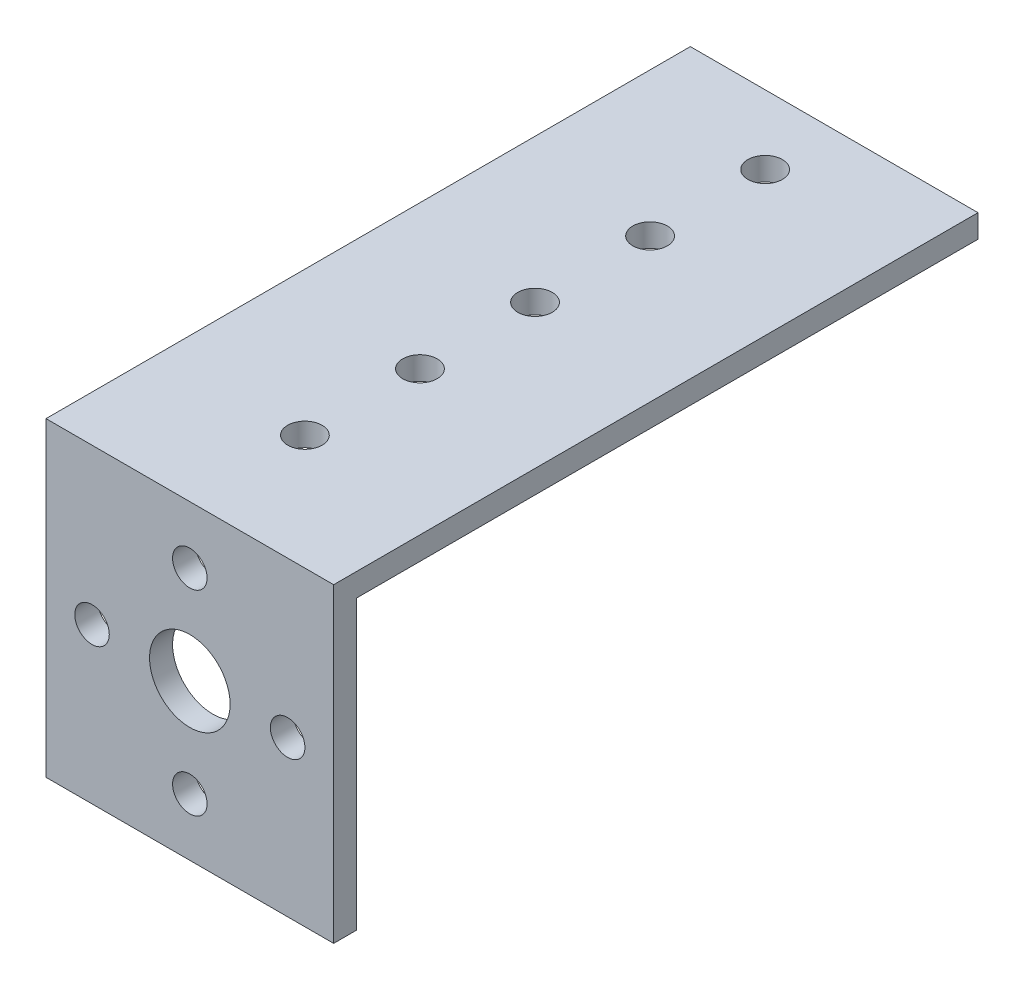
ISO-10303-21;
HEADER;
FILE_DESCRIPTION(('STEP AP214'),'2;1');
FILE_NAME('part.step','',(''),(''),'','','');
FILE_SCHEMA(('AUTOMOTIVE_DESIGN { 1 0 10303 214 1 1 1 1 }'));
ENDSEC;
DATA;
#1=APPLICATION_CONTEXT('core data for automotive mechanical design processes');
#2=APPLICATION_PROTOCOL_DEFINITION('international standard','automotive_design',2000,#1);
#3=PRODUCT_CONTEXT('',#1,'mechanical');
#4=PRODUCT('Part','Part','',(#3));
#5=PRODUCT_RELATED_PRODUCT_CATEGORY('part','',(#4));
#6=PRODUCT_DEFINITION_FORMATION('','',#4);
#7=PRODUCT_DEFINITION_CONTEXT('part definition',#1,'design');
#8=PRODUCT_DEFINITION('design','',#6,#7);
#9=PRODUCT_DEFINITION_SHAPE('','',#8);
#10=(LENGTH_UNIT() NAMED_UNIT(*) SI_UNIT(.MILLI.,.METRE.));
#11=(NAMED_UNIT(*) PLANE_ANGLE_UNIT() SI_UNIT($,.RADIAN.));
#12=(NAMED_UNIT(*) SI_UNIT($,.STERADIAN.) SOLID_ANGLE_UNIT());
#13=UNCERTAINTY_MEASURE_WITH_UNIT(LENGTH_MEASURE(1.E-05),#10,'distance_accuracy_value','');
#14=(GEOMETRIC_REPRESENTATION_CONTEXT(3) GLOBAL_UNCERTAINTY_ASSIGNED_CONTEXT((#13)) GLOBAL_UNIT_ASSIGNED_CONTEXT((#10,
#11,#12)) REPRESENTATION_CONTEXT('',''));
#15=CARTESIAN_POINT('',(0.,0.,0.));
#16=DIRECTION('',(0.,0.,1.));
#17=DIRECTION('',(1.,0.,0.));
#18=AXIS2_PLACEMENT_3D('',#15,#16,#17);
#19=CARTESIAN_POINT('',(25.,0.,-2.));
#20=DIRECTION('',(0.,1.,0.));
#21=DIRECTION('',(0.,0.,1.));
#22=AXIS2_PLACEMENT_3D('',#19,#20,#21);
#23=PLANE('',#22);
#24=DIRECTION('',(0.,0.,-1.));
#25=VECTOR('',#24,1.);
#26=CARTESIAN_POINT('',(0.,0.,-2.));
#27=LINE('',#26,#25);
#28=CARTESIAN_POINT('',(0.,0.,0.));
#29=VERTEX_POINT('',#28);
#30=CARTESIAN_POINT('',(0.,0.,-2.));
#31=VERTEX_POINT('',#30);
#32=EDGE_CURVE('E127',#29,#31,#27,.T.);
#33=ORIENTED_EDGE('',*,*,#32,.T.);
#34=DIRECTION('',(-1.,0.,0.));
#35=VECTOR('',#34,1.);
#36=CARTESIAN_POINT('',(25.,0.,-2.));
#37=LINE('',#36,#35);
#38=CARTESIAN_POINT('',(25.,0.,-2.));
#39=VERTEX_POINT('',#38);
#40=EDGE_CURVE('E11',#39,#31,#37,.T.);
#41=ORIENTED_EDGE('',*,*,#40,.F.);
#42=DIRECTION('',(0.,0.,-1.));
#43=VECTOR('',#42,1.);
#44=CARTESIAN_POINT('',(25.,0.,-2.));
#45=LINE('',#44,#43);
#46=CARTESIAN_POINT('',(25.,0.,0.));
#47=VERTEX_POINT('',#46);
#48=EDGE_CURVE('E144',#47,#39,#45,.T.);
#49=ORIENTED_EDGE('',*,*,#48,.F.);
#50=DIRECTION('',(-1.,0.,0.));
#51=VECTOR('',#50,1.);
#52=CARTESIAN_POINT('',(25.,0.,0.));
#53=LINE('',#52,#51);
#54=EDGE_CURVE('E123',#47,#29,#53,.T.);
#55=ORIENTED_EDGE('',*,*,#54,.T.);
#56=EDGE_LOOP('',(#33,#41,#49,#55));
#57=FACE_BOUND('',#56,.T.);
#58=ADVANCED_FACE('F38',(#57),#23,.F.);
#59=CARTESIAN_POINT('',(25.,25.,-2.));
#60=DIRECTION('',(0.,0.,1.));
#61=DIRECTION('',(0.,-1.,0.));
#62=AXIS2_PLACEMENT_3D('',#59,#60,#61);
#63=PLANE('',#62);
#64=CARTESIAN_POINT('',(12.5,22.,-2.));
#65=DIRECTION('',(0.,0.,1.));
#66=DIRECTION('',(0.,-1.,0.));
#67=AXIS2_PLACEMENT_3D('',#64,#65,#66);
#68=CIRCLE('',#67,1.5);
#69=CARTESIAN_POINT('',(12.5,20.5,-2.));
#70=VERTEX_POINT('',#69);
#71=EDGE_CURVE('E132',#70,#70,#68,.T.);
#72=ORIENTED_EDGE('',*,*,#71,.T.);
#73=EDGE_LOOP('',(#72));
#74=FACE_BOUND('',#73,.T.);
#75=CARTESIAN_POINT('',(12.5,5.00000000000001,-2.));
#76=DIRECTION('',(0.,0.,1.));
#77=DIRECTION('',(0.,-1.,0.));
#78=AXIS2_PLACEMENT_3D('',#75,#76,#77);
#79=CIRCLE('',#78,1.5);
#80=CARTESIAN_POINT('',(12.5,3.50000000000001,-2.));
#81=VERTEX_POINT('',#80);
#82=EDGE_CURVE('E368',#81,#81,#79,.T.);
#83=ORIENTED_EDGE('',*,*,#82,.T.);
#84=EDGE_LOOP('',(#83));
#85=FACE_BOUND('',#84,.T.);
#86=CARTESIAN_POINT('',(21.,13.5,-2.));
#87=DIRECTION('',(0.,0.,1.));
#88=DIRECTION('',(0.,-1.,0.));
#89=AXIS2_PLACEMENT_3D('',#86,#87,#88);
#90=CIRCLE('',#89,1.5);
#91=CARTESIAN_POINT('',(21.,12.,-2.));
#92=VERTEX_POINT('',#91);
#93=EDGE_CURVE('E364',#92,#92,#90,.T.);
#94=ORIENTED_EDGE('',*,*,#93,.T.);
#95=EDGE_LOOP('',(#94));
#96=FACE_BOUND('',#95,.T.);
#97=CARTESIAN_POINT('',(12.5,13.5,-2.));
#98=DIRECTION('',(0.,0.,1.));
#99=DIRECTION('',(0.,-1.,0.));
#100=AXIS2_PLACEMENT_3D('',#97,#98,#99);
#101=CIRCLE('',#100,3.5);
#102=CARTESIAN_POINT('',(12.5,10.,-2.));
#103=VERTEX_POINT('',#102);
#104=EDGE_CURVE('E360',#103,#103,#101,.T.);
#105=ORIENTED_EDGE('',*,*,#104,.T.);
#106=EDGE_LOOP('',(#105));
#107=FACE_BOUND('',#106,.T.);
#108=CARTESIAN_POINT('',(4.,13.5,-2.));
#109=DIRECTION('',(0.,0.,1.));
#110=DIRECTION('',(0.,-1.,0.));
#111=AXIS2_PLACEMENT_3D('',#108,#109,#110);
#112=CIRCLE('',#111,1.5);
#113=CARTESIAN_POINT('',(4.,12.,-2.));
#114=VERTEX_POINT('',#113);
#115=EDGE_CURVE('E345',#114,#114,#112,.T.);
#116=ORIENTED_EDGE('',*,*,#115,.T.);
#117=EDGE_LOOP('',(#116));
#118=FACE_BOUND('',#117,.T.);
#119=DIRECTION('',(0.,1.,0.));
#120=VECTOR('',#119,1.);
#121=CARTESIAN_POINT('',(0.,25.,-2.));
#122=LINE('',#121,#120);
#123=CARTESIAN_POINT('',(0.,25.,-2.));
#124=VERTEX_POINT('',#123);
#125=EDGE_CURVE('E131',#31,#124,#122,.T.);
#126=ORIENTED_EDGE('',*,*,#125,.T.);
#127=DIRECTION('',(-1.,0.,0.));
#128=VECTOR('',#127,1.);
#129=CARTESIAN_POINT('',(25.,25.,-2.));
#130=LINE('',#129,#128);
#131=CARTESIAN_POINT('',(25.,25.,-2.));
#132=VERTEX_POINT('',#131);
#133=EDGE_CURVE('E47',#132,#124,#130,.T.);
#134=ORIENTED_EDGE('',*,*,#133,.F.);
#135=DIRECTION('',(0.,1.,0.));
#136=VECTOR('',#135,1.);
#137=CARTESIAN_POINT('',(25.,25.,-2.));
#138=LINE('',#137,#136);
#139=EDGE_CURVE('E92',#39,#132,#138,.T.);
#140=ORIENTED_EDGE('',*,*,#139,.F.);
#141=ORIENTED_EDGE('',*,*,#40,.T.);
#142=EDGE_LOOP('',(#126,#134,#140,#141));
#143=FACE_BOUND('',#142,.T.);
#144=ADVANCED_FACE('F178',(#74,#85,#96,#107,#118,#143),#63,.F.);
#145=CARTESIAN_POINT('',(25.,25.,-56.));
#146=DIRECTION('',(0.,1.,0.));
#147=DIRECTION('',(0.,0.,1.));
#148=AXIS2_PLACEMENT_3D('',#145,#146,#147);
#149=PLANE('',#148);
#150=CARTESIAN_POINT('',(12.5,25.,-10.));
#151=DIRECTION('',(0.,1.,0.));
#152=DIRECTION('',(0.,0.,1.));
#153=AXIS2_PLACEMENT_3D('',#150,#151,#152);
#154=CIRCLE('',#153,1.5);
#155=CARTESIAN_POINT('',(12.5,25.,-8.5));
#156=VERTEX_POINT('',#155);
#157=EDGE_CURVE('E326',#156,#156,#154,.T.);
#158=ORIENTED_EDGE('',*,*,#157,.T.);
#159=EDGE_LOOP('',(#158));
#160=FACE_BOUND('',#159,.T.);
#161=CARTESIAN_POINT('',(12.5,25.,-20.));
#162=DIRECTION('',(0.,1.,0.));
#163=DIRECTION('',(0.,0.,1.));
#164=AXIS2_PLACEMENT_3D('',#161,#162,#163);
#165=CIRCLE('',#164,1.5);
#166=CARTESIAN_POINT('',(12.5,25.,-18.5));
#167=VERTEX_POINT('',#166);
#168=EDGE_CURVE('E329',#167,#167,#165,.T.);
#169=ORIENTED_EDGE('',*,*,#168,.T.);
#170=EDGE_LOOP('',(#169));
#171=FACE_BOUND('',#170,.T.);
#172=CARTESIAN_POINT('',(12.5,25.,-30.));
#173=DIRECTION('',(0.,1.,0.));
#174=DIRECTION('',(0.,0.,1.));
#175=AXIS2_PLACEMENT_3D('',#172,#173,#174);
#176=CIRCLE('',#175,1.5);
#177=CARTESIAN_POINT('',(12.5,25.,-28.5));
#178=VERTEX_POINT('',#177);
#179=EDGE_CURVE('E337',#178,#178,#176,.T.);
#180=ORIENTED_EDGE('',*,*,#179,.T.);
#181=EDGE_LOOP('',(#180));
#182=FACE_BOUND('',#181,.T.);
#183=CARTESIAN_POINT('',(12.5,25.,-40.));
#184=DIRECTION('',(0.,1.,0.));
#185=DIRECTION('',(0.,0.,1.));
#186=AXIS2_PLACEMENT_3D('',#183,#184,#185);
#187=CIRCLE('',#186,1.5);
#188=CARTESIAN_POINT('',(12.5,25.,-38.5));
#189=VERTEX_POINT('',#188);
#190=EDGE_CURVE('E400',#189,#189,#187,.T.);
#191=ORIENTED_EDGE('',*,*,#190,.T.);
#192=EDGE_LOOP('',(#191));
#193=FACE_BOUND('',#192,.T.);
#194=CARTESIAN_POINT('',(12.5,25.,-50.));
#195=DIRECTION('',(0.,1.,0.));
#196=DIRECTION('',(0.,0.,1.));
#197=AXIS2_PLACEMENT_3D('',#194,#195,#196);
#198=CIRCLE('',#197,1.5);
#199=CARTESIAN_POINT('',(12.5,25.,-48.5));
#200=VERTEX_POINT('',#199);
#201=EDGE_CURVE('E404',#200,#200,#198,.T.);
#202=ORIENTED_EDGE('',*,*,#201,.T.);
#203=EDGE_LOOP('',(#202));
#204=FACE_BOUND('',#203,.T.);
#205=DIRECTION('',(0.,0.,-1.));
#206=VECTOR('',#205,1.);
#207=CARTESIAN_POINT('',(0.,25.,-56.));
#208=LINE('',#207,#206);
#209=CARTESIAN_POINT('',(0.,25.,-56.));
#210=VERTEX_POINT('',#209);
#211=EDGE_CURVE('E135',#124,#210,#208,.T.);
#212=ORIENTED_EDGE('',*,*,#211,.T.);
#213=DIRECTION('',(-1.,0.,0.));
#214=VECTOR('',#213,1.);
#215=CARTESIAN_POINT('',(25.,25.,-56.));
#216=LINE('',#215,#214);
#217=CARTESIAN_POINT('',(25.,25.,-56.));
#218=VERTEX_POINT('',#217);
#219=EDGE_CURVE('E116',#218,#210,#216,.T.);
#220=ORIENTED_EDGE('',*,*,#219,.F.);
#221=DIRECTION('',(0.,0.,-1.));
#222=VECTOR('',#221,1.);
#223=CARTESIAN_POINT('',(25.,25.,-56.));
#224=LINE('',#223,#222);
#225=EDGE_CURVE('E105',#132,#218,#224,.T.);
#226=ORIENTED_EDGE('',*,*,#225,.F.);
#227=ORIENTED_EDGE('',*,*,#133,.T.);
#228=EDGE_LOOP('',(#212,#220,#226,#227));
#229=FACE_BOUND('',#228,.T.);
#230=ADVANCED_FACE('F154',(#160,#171,#182,#193,#204,#229),#149,.F.);
#231=CARTESIAN_POINT('',(25.,27.,-56.));
#232=DIRECTION('',(0.,0.,1.));
#233=DIRECTION('',(1.,0.,0.));
#234=AXIS2_PLACEMENT_3D('',#231,#232,#233);
#235=PLANE('',#234);
#236=DIRECTION('',(0.,1.,0.));
#237=VECTOR('',#236,1.);
#238=CARTESIAN_POINT('',(0.,27.,-56.));
#239=LINE('',#238,#237);
#240=CARTESIAN_POINT('',(0.,27.,-56.));
#241=VERTEX_POINT('',#240);
#242=EDGE_CURVE('E114',#210,#241,#239,.T.);
#243=ORIENTED_EDGE('',*,*,#242,.T.);
#244=DIRECTION('',(-1.,0.,0.));
#245=VECTOR('',#244,1.);
#246=CARTESIAN_POINT('',(25.,27.,-56.));
#247=LINE('',#246,#245);
#248=CARTESIAN_POINT('',(25.,27.,-56.));
#249=VERTEX_POINT('',#248);
#250=EDGE_CURVE('E111',#249,#241,#247,.T.);
#251=ORIENTED_EDGE('',*,*,#250,.F.);
#252=DIRECTION('',(0.,1.,0.));
#253=VECTOR('',#252,1.);
#254=CARTESIAN_POINT('',(25.,27.,-56.));
#255=LINE('',#254,#253);
#256=EDGE_CURVE('E99',#218,#249,#255,.T.);
#257=ORIENTED_EDGE('',*,*,#256,.F.);
#258=ORIENTED_EDGE('',*,*,#219,.T.);
#259=EDGE_LOOP('',(#243,#251,#257,#258));
#260=FACE_BOUND('',#259,.T.);
#261=ADVANCED_FACE('F112',(#260),#235,.F.);
#262=CARTESIAN_POINT('',(25.,27.,0.));
#263=DIRECTION('',(0.,-1.,0.));
#264=DIRECTION('',(0.,0.,-1.));
#265=AXIS2_PLACEMENT_3D('',#262,#263,#264);
#266=PLANE('',#265);
#267=CARTESIAN_POINT('',(12.5,27.,-10.));
#268=DIRECTION('',(0.,1.,0.));
#269=DIRECTION('',(0.,0.,1.));
#270=AXIS2_PLACEMENT_3D('',#267,#268,#269);
#271=CIRCLE('',#270,1.5);
#272=CARTESIAN_POINT('',(12.5,27.,-8.5));
#273=VERTEX_POINT('',#272);
#274=EDGE_CURVE('E323',#273,#273,#271,.T.);
#275=ORIENTED_EDGE('',*,*,#274,.F.);
#276=EDGE_LOOP('',(#275));
#277=FACE_BOUND('',#276,.T.);
#278=CARTESIAN_POINT('',(12.5,27.,-20.));
#279=DIRECTION('',(0.,1.,0.));
#280=DIRECTION('',(0.,0.,1.));
#281=AXIS2_PLACEMENT_3D('',#278,#279,#280);
#282=CIRCLE('',#281,1.5);
#283=CARTESIAN_POINT('',(12.5,27.,-18.5));
#284=VERTEX_POINT('',#283);
#285=EDGE_CURVE('E420',#284,#284,#282,.T.);
#286=ORIENTED_EDGE('',*,*,#285,.F.);
#287=EDGE_LOOP('',(#286));
#288=FACE_BOUND('',#287,.T.);
#289=CARTESIAN_POINT('',(12.5,27.,-30.));
#290=DIRECTION('',(0.,1.,0.));
#291=DIRECTION('',(0.,0.,1.));
#292=AXIS2_PLACEMENT_3D('',#289,#290,#291);
#293=CIRCLE('',#292,1.5);
#294=CARTESIAN_POINT('',(12.5,27.,-28.5));
#295=VERTEX_POINT('',#294);
#296=EDGE_CURVE('E416',#295,#295,#293,.T.);
#297=ORIENTED_EDGE('',*,*,#296,.F.);
#298=EDGE_LOOP('',(#297));
#299=FACE_BOUND('',#298,.T.);
#300=CARTESIAN_POINT('',(12.5,27.,-40.));
#301=DIRECTION('',(0.,1.,0.));
#302=DIRECTION('',(0.,0.,1.));
#303=AXIS2_PLACEMENT_3D('',#300,#301,#302);
#304=CIRCLE('',#303,1.5);
#305=CARTESIAN_POINT('',(12.5,27.,-38.5));
#306=VERTEX_POINT('',#305);
#307=EDGE_CURVE('E412',#306,#306,#304,.T.);
#308=ORIENTED_EDGE('',*,*,#307,.F.);
#309=EDGE_LOOP('',(#308));
#310=FACE_BOUND('',#309,.T.);
#311=CARTESIAN_POINT('',(12.5,27.,-50.));
#312=DIRECTION('',(0.,1.,0.));
#313=DIRECTION('',(0.,0.,1.));
#314=AXIS2_PLACEMENT_3D('',#311,#312,#313);
#315=CIRCLE('',#314,1.5);
#316=CARTESIAN_POINT('',(12.5,27.,-48.5));
#317=VERTEX_POINT('',#316);
#318=EDGE_CURVE('E408',#317,#317,#315,.T.);
#319=ORIENTED_EDGE('',*,*,#318,.F.);
#320=EDGE_LOOP('',(#319));
#321=FACE_BOUND('',#320,.T.);
#322=DIRECTION('',(0.,0.,1.));
#323=VECTOR('',#322,1.);
#324=CARTESIAN_POINT('',(0.,27.,0.));
#325=LINE('',#324,#323);
#326=CARTESIAN_POINT('',(0.,27.,0.));
#327=VERTEX_POINT('',#326);
#328=EDGE_CURVE('E78',#241,#327,#325,.T.);
#329=ORIENTED_EDGE('',*,*,#328,.T.);
#330=DIRECTION('',(-1.,0.,0.));
#331=VECTOR('',#330,1.);
#332=CARTESIAN_POINT('',(25.,27.,0.));
#333=LINE('',#332,#331);
#334=CARTESIAN_POINT('',(25.,27.,0.));
#335=VERTEX_POINT('',#334);
#336=EDGE_CURVE('E117',#335,#327,#333,.T.);
#337=ORIENTED_EDGE('',*,*,#336,.F.);
#338=DIRECTION('',(0.,0.,1.));
#339=VECTOR('',#338,1.);
#340=CARTESIAN_POINT('',(25.,27.,0.));
#341=LINE('',#340,#339);
#342=EDGE_CURVE('E103',#249,#335,#341,.T.);
#343=ORIENTED_EDGE('',*,*,#342,.F.);
#344=ORIENTED_EDGE('',*,*,#250,.T.);
#345=EDGE_LOOP('',(#329,#337,#343,#344));
#346=FACE_BOUND('',#345,.T.);
#347=ADVANCED_FACE('F119',(#277,#288,#299,#310,#321,#346),#266,.F.);
#348=CARTESIAN_POINT('',(25.,0.,0.));
#349=DIRECTION('',(0.,0.,-1.));
#350=DIRECTION('',(-1.,0.,0.));
#351=AXIS2_PLACEMENT_3D('',#348,#349,#350);
#352=PLANE('',#351);
#353=CARTESIAN_POINT('',(12.5,22.,0.));
#354=DIRECTION('',(0.,0.,1.));
#355=DIRECTION('',(1.,0.,0.));
#356=AXIS2_PLACEMENT_3D('',#353,#354,#355);
#357=CIRCLE('',#356,1.5);
#358=CARTESIAN_POINT('',(14.,22.,0.));
#359=VERTEX_POINT('',#358);
#360=EDGE_CURVE('E341',#359,#359,#357,.T.);
#361=ORIENTED_EDGE('',*,*,#360,.F.);
#362=EDGE_LOOP('',(#361));
#363=FACE_BOUND('',#362,.T.);
#364=CARTESIAN_POINT('',(12.5,5.00000000000001,0.));
#365=DIRECTION('',(0.,0.,1.));
#366=DIRECTION('',(1.,0.,0.));
#367=AXIS2_PLACEMENT_3D('',#364,#365,#366);
#368=CIRCLE('',#367,1.5);
#369=CARTESIAN_POINT('',(14.,5.00000000000001,0.));
#370=VERTEX_POINT('',#369);
#371=EDGE_CURVE('E328',#370,#370,#368,.T.);
#372=ORIENTED_EDGE('',*,*,#371,.F.);
#373=EDGE_LOOP('',(#372));
#374=FACE_BOUND('',#373,.T.);
#375=CARTESIAN_POINT('',(21.,13.5,0.));
#376=DIRECTION('',(0.,0.,1.));
#377=DIRECTION('',(1.,0.,0.));
#378=AXIS2_PLACEMENT_3D('',#375,#376,#377);
#379=CIRCLE('',#378,1.5);
#380=CARTESIAN_POINT('',(22.5,13.5,0.));
#381=VERTEX_POINT('',#380);
#382=EDGE_CURVE('E334',#381,#381,#379,.T.);
#383=ORIENTED_EDGE('',*,*,#382,.F.);
#384=EDGE_LOOP('',(#383));
#385=FACE_BOUND('',#384,.T.);
#386=CARTESIAN_POINT('',(12.5,13.5,0.));
#387=DIRECTION('',(0.,0.,1.));
#388=DIRECTION('',(1.,0.,0.));
#389=AXIS2_PLACEMENT_3D('',#386,#387,#388);
#390=CIRCLE('',#389,3.5);
#391=CARTESIAN_POINT('',(16.,13.5,0.));
#392=VERTEX_POINT('',#391);
#393=EDGE_CURVE('E349',#392,#392,#390,.T.);
#394=ORIENTED_EDGE('',*,*,#393,.F.);
#395=EDGE_LOOP('',(#394));
#396=FACE_BOUND('',#395,.T.);
#397=CARTESIAN_POINT('',(4.,13.5,0.));
#398=DIRECTION('',(0.,0.,1.));
#399=DIRECTION('',(1.,0.,0.));
#400=AXIS2_PLACEMENT_3D('',#397,#398,#399);
#401=CIRCLE('',#400,1.5);
#402=CARTESIAN_POINT('',(5.5,13.5,0.));
#403=VERTEX_POINT('',#402);
#404=EDGE_CURVE('E346',#403,#403,#401,.T.);
#405=ORIENTED_EDGE('',*,*,#404,.F.);
#406=EDGE_LOOP('',(#405));
#407=FACE_BOUND('',#406,.T.);
#408=DIRECTION('',(0.,-1.,0.));
#409=VECTOR('',#408,1.);
#410=CARTESIAN_POINT('',(0.,0.,0.));
#411=LINE('',#410,#409);
#412=EDGE_CURVE('E84',#327,#29,#411,.T.);
#413=ORIENTED_EDGE('',*,*,#412,.T.);
#414=ORIENTED_EDGE('',*,*,#54,.F.);
#415=DIRECTION('',(0.,-1.,0.));
#416=VECTOR('',#415,1.);
#417=CARTESIAN_POINT('',(25.,0.,0.));
#418=LINE('',#417,#416);
#419=EDGE_CURVE('E55',#335,#47,#418,.T.);
#420=ORIENTED_EDGE('',*,*,#419,.F.);
#421=ORIENTED_EDGE('',*,*,#336,.T.);
#422=EDGE_LOOP('',(#413,#414,#420,#421));
#423=FACE_BOUND('',#422,.T.);
#424=ADVANCED_FACE('F161',(#363,#374,#385,#396,#407,#423),#352,.F.);
#425=CARTESIAN_POINT('',(25.,0.,0.));
#426=DIRECTION('',(-1.,0.,0.));
#427=DIRECTION('',(0.,0.,1.));
#428=AXIS2_PLACEMENT_3D('',#425,#426,#427);
#429=PLANE('',#428);
#430=ORIENTED_EDGE('',*,*,#48,.T.);
#431=ORIENTED_EDGE('',*,*,#139,.T.);
#432=ORIENTED_EDGE('',*,*,#225,.T.);
#433=ORIENTED_EDGE('',*,*,#256,.T.);
#434=ORIENTED_EDGE('',*,*,#342,.T.);
#435=ORIENTED_EDGE('',*,*,#419,.T.);
#436=EDGE_LOOP('',(#430,#431,#432,#433,#434,#435));
#437=FACE_BOUND('',#436,.T.);
#438=ADVANCED_FACE('F101',(#437),#429,.F.);
#439=CARTESIAN_POINT('',(0.,0.,0.));
#440=DIRECTION('',(-1.,0.,0.));
#441=DIRECTION('',(0.,0.,1.));
#442=AXIS2_PLACEMENT_3D('',#439,#440,#441);
#443=PLANE('',#442);
#444=ORIENTED_EDGE('',*,*,#32,.F.);
#445=ORIENTED_EDGE('',*,*,#412,.F.);
#446=ORIENTED_EDGE('',*,*,#328,.F.);
#447=ORIENTED_EDGE('',*,*,#242,.F.);
#448=ORIENTED_EDGE('',*,*,#211,.F.);
#449=ORIENTED_EDGE('',*,*,#125,.F.);
#450=EDGE_LOOP('',(#444,#445,#446,#447,#448,#449));
#451=FACE_BOUND('',#450,.T.);
#452=ADVANCED_FACE('F157',(#451),#443,.T.);
#453=CARTESIAN_POINT('',(4.,13.5,-25.));
#454=DIRECTION('',(0.,0.,1.));
#455=DIRECTION('',(1.,0.,0.));
#456=AXIS2_PLACEMENT_3D('',#453,#454,#455);
#457=CYLINDRICAL_SURFACE('',#456,1.5);
#458=ORIENTED_EDGE('',*,*,#404,.T.);
#459=EDGE_LOOP('',(#458));
#460=FACE_BOUND('',#459,.T.);
#461=ORIENTED_EDGE('',*,*,#115,.F.);
#462=EDGE_LOOP('',(#461));
#463=FACE_BOUND('',#462,.T.);
#464=ADVANCED_FACE('F217',(#460,#463),#457,.F.);
#465=CARTESIAN_POINT('',(12.5,13.5,-25.));
#466=DIRECTION('',(0.,0.,1.));
#467=DIRECTION('',(1.,0.,0.));
#468=AXIS2_PLACEMENT_3D('',#465,#466,#467);
#469=CYLINDRICAL_SURFACE('',#468,3.5);
#470=ORIENTED_EDGE('',*,*,#393,.T.);
#471=EDGE_LOOP('',(#470));
#472=FACE_BOUND('',#471,.T.);
#473=ORIENTED_EDGE('',*,*,#104,.F.);
#474=EDGE_LOOP('',(#473));
#475=FACE_BOUND('',#474,.T.);
#476=ADVANCED_FACE('F222',(#472,#475),#469,.F.);
#477=CARTESIAN_POINT('',(21.,13.5,-25.));
#478=DIRECTION('',(0.,0.,1.));
#479=DIRECTION('',(1.,0.,0.));
#480=AXIS2_PLACEMENT_3D('',#477,#478,#479);
#481=CYLINDRICAL_SURFACE('',#480,1.5);
#482=ORIENTED_EDGE('',*,*,#382,.T.);
#483=EDGE_LOOP('',(#482));
#484=FACE_BOUND('',#483,.T.);
#485=ORIENTED_EDGE('',*,*,#93,.F.);
#486=EDGE_LOOP('',(#485));
#487=FACE_BOUND('',#486,.T.);
#488=ADVANCED_FACE('F230',(#484,#487),#481,.F.);
#489=CARTESIAN_POINT('',(12.5,5.00000000000001,-25.));
#490=DIRECTION('',(0.,0.,1.));
#491=DIRECTION('',(1.,0.,0.));
#492=AXIS2_PLACEMENT_3D('',#489,#490,#491);
#493=CYLINDRICAL_SURFACE('',#492,1.5);
#494=ORIENTED_EDGE('',*,*,#371,.T.);
#495=EDGE_LOOP('',(#494));
#496=FACE_BOUND('',#495,.T.);
#497=ORIENTED_EDGE('',*,*,#82,.F.);
#498=EDGE_LOOP('',(#497));
#499=FACE_BOUND('',#498,.T.);
#500=ADVANCED_FACE('F238',(#496,#499),#493,.F.);
#501=CARTESIAN_POINT('',(12.5,22.,-25.));
#502=DIRECTION('',(0.,0.,1.));
#503=DIRECTION('',(1.,0.,0.));
#504=AXIS2_PLACEMENT_3D('',#501,#502,#503);
#505=CYLINDRICAL_SURFACE('',#504,1.5);
#506=ORIENTED_EDGE('',*,*,#360,.T.);
#507=EDGE_LOOP('',(#506));
#508=FACE_BOUND('',#507,.T.);
#509=ORIENTED_EDGE('',*,*,#71,.F.);
#510=EDGE_LOOP('',(#509));
#511=FACE_BOUND('',#510,.T.);
#512=ADVANCED_FACE('F246',(#508,#511),#505,.F.);
#513=CARTESIAN_POINT('',(12.5,2.00000000000001,-50.));
#514=DIRECTION('',(0.,1.,0.));
#515=DIRECTION('',(0.,0.,1.));
#516=AXIS2_PLACEMENT_3D('',#513,#514,#515);
#517=CYLINDRICAL_SURFACE('',#516,1.5);
#518=ORIENTED_EDGE('',*,*,#318,.T.);
#519=EDGE_LOOP('',(#518));
#520=FACE_BOUND('',#519,.T.);
#521=ORIENTED_EDGE('',*,*,#201,.F.);
#522=EDGE_LOOP('',(#521));
#523=FACE_BOUND('',#522,.T.);
#524=ADVANCED_FACE('F254',(#520,#523),#517,.F.);
#525=CARTESIAN_POINT('',(12.5,2.00000000000001,-40.));
#526=DIRECTION('',(0.,1.,0.));
#527=DIRECTION('',(0.,0.,1.));
#528=AXIS2_PLACEMENT_3D('',#525,#526,#527);
#529=CYLINDRICAL_SURFACE('',#528,1.5);
#530=ORIENTED_EDGE('',*,*,#307,.T.);
#531=EDGE_LOOP('',(#530));
#532=FACE_BOUND('',#531,.T.);
#533=ORIENTED_EDGE('',*,*,#190,.F.);
#534=EDGE_LOOP('',(#533));
#535=FACE_BOUND('',#534,.T.);
#536=ADVANCED_FACE('F261',(#532,#535),#529,.F.);
#537=CARTESIAN_POINT('',(12.5,2.00000000000001,-30.));
#538=DIRECTION('',(0.,1.,0.));
#539=DIRECTION('',(0.,0.,1.));
#540=AXIS2_PLACEMENT_3D('',#537,#538,#539);
#541=CYLINDRICAL_SURFACE('',#540,1.5);
#542=ORIENTED_EDGE('',*,*,#296,.T.);
#543=EDGE_LOOP('',(#542));
#544=FACE_BOUND('',#543,.T.);
#545=ORIENTED_EDGE('',*,*,#179,.F.);
#546=EDGE_LOOP('',(#545));
#547=FACE_BOUND('',#546,.T.);
#548=ADVANCED_FACE('F269',(#544,#547),#541,.F.);
#549=CARTESIAN_POINT('',(12.5,2.00000000000001,-20.));
#550=DIRECTION('',(0.,1.,0.));
#551=DIRECTION('',(0.,0.,1.));
#552=AXIS2_PLACEMENT_3D('',#549,#550,#551);
#553=CYLINDRICAL_SURFACE('',#552,1.5);
#554=ORIENTED_EDGE('',*,*,#285,.T.);
#555=EDGE_LOOP('',(#554));
#556=FACE_BOUND('',#555,.T.);
#557=ORIENTED_EDGE('',*,*,#168,.F.);
#558=EDGE_LOOP('',(#557));
#559=FACE_BOUND('',#558,.T.);
#560=ADVANCED_FACE('F277',(#556,#559),#553,.F.);
#561=CARTESIAN_POINT('',(12.5,2.00000000000001,-10.));
#562=DIRECTION('',(0.,1.,0.));
#563=DIRECTION('',(0.,0.,1.));
#564=AXIS2_PLACEMENT_3D('',#561,#562,#563);
#565=CYLINDRICAL_SURFACE('',#564,1.5);
#566=ORIENTED_EDGE('',*,*,#274,.T.);
#567=EDGE_LOOP('',(#566));
#568=FACE_BOUND('',#567,.T.);
#569=ORIENTED_EDGE('',*,*,#157,.F.);
#570=EDGE_LOOP('',(#569));
#571=FACE_BOUND('',#570,.T.);
#572=ADVANCED_FACE('F285',(#568,#571),#565,.F.);
#573=CLOSED_SHELL('',(#58,#144,#230,#261,#347,#424,#438,#452,#464,#476,#488,#500,#512,#524,#536,
#548,#560,#572));
#574=MANIFOLD_SOLID_BREP('B2',#573);
#575=ADVANCED_BREP_SHAPE_REPRESENTATION('',(#18,#574),#14);
#576=SHAPE_DEFINITION_REPRESENTATION(#9,#575);
ENDSEC;
END-ISO-10303-21;
